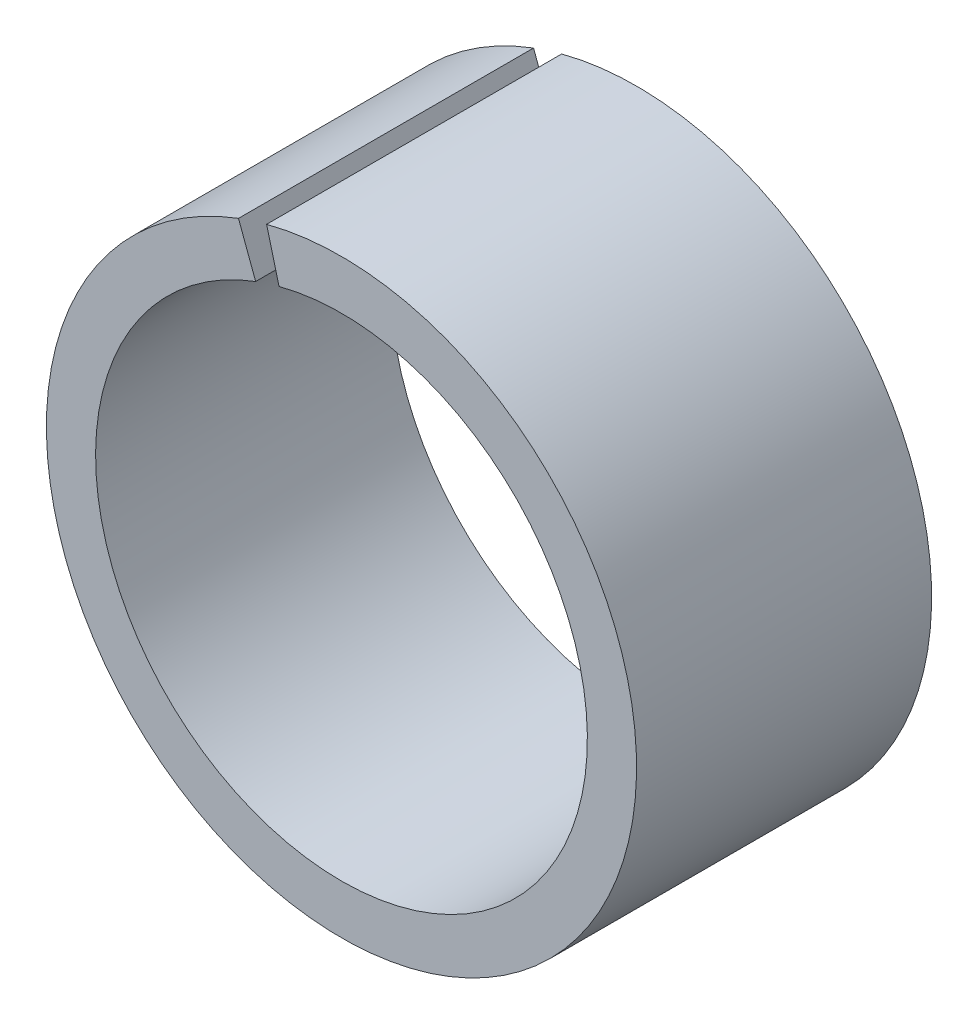
ISO-10303-21;
HEADER;
FILE_DESCRIPTION(('STEP AP214'),'2;1');
FILE_NAME('part.step','',(''),(''),'','','');
FILE_SCHEMA(('AUTOMOTIVE_DESIGN { 1 0 10303 214 1 1 1 1 }'));
ENDSEC;
DATA;
#1=APPLICATION_CONTEXT('core data for automotive mechanical design processes');
#2=APPLICATION_PROTOCOL_DEFINITION('international standard','automotive_design',2000,#1);
#3=PRODUCT_CONTEXT('',#1,'mechanical');
#4=PRODUCT('Part','Part','',(#3));
#5=PRODUCT_RELATED_PRODUCT_CATEGORY('part','',(#4));
#6=PRODUCT_DEFINITION_FORMATION('','',#4);
#7=PRODUCT_DEFINITION_CONTEXT('part definition',#1,'design');
#8=PRODUCT_DEFINITION('design','',#6,#7);
#9=PRODUCT_DEFINITION_SHAPE('','',#8);
#10=(LENGTH_UNIT() NAMED_UNIT(*) SI_UNIT(.MILLI.,.METRE.));
#11=(NAMED_UNIT(*) PLANE_ANGLE_UNIT() SI_UNIT($,.RADIAN.));
#12=(NAMED_UNIT(*) SI_UNIT($,.STERADIAN.) SOLID_ANGLE_UNIT());
#13=UNCERTAINTY_MEASURE_WITH_UNIT(LENGTH_MEASURE(1.E-05),#10,'distance_accuracy_value','');
#14=(GEOMETRIC_REPRESENTATION_CONTEXT(3) GLOBAL_UNCERTAINTY_ASSIGNED_CONTEXT((#13)) GLOBAL_UNIT_ASSIGNED_CONTEXT((#10,
#11,#12)) REPRESENTATION_CONTEXT('',''));
#15=CARTESIAN_POINT('',(0.,0.,0.));
#16=DIRECTION('',(0.,0.,1.));
#17=DIRECTION('',(1.,0.,0.));
#18=AXIS2_PLACEMENT_3D('',#15,#16,#17);
#19=CARTESIAN_POINT('',(0.,0.,6.));
#20=DIRECTION('',(0.,0.,1.));
#21=DIRECTION('',(1.,0.,0.));
#22=AXIS2_PLACEMENT_3D('',#19,#20,#21);
#23=PLANE('',#22);
#24=DIRECTION('',(-0.253787310354396,0.967260048333995,0.));
#25=VECTOR('',#24,1.);
#26=CARTESIAN_POINT('',(0.,0.,6.));
#27=LINE('',#26,#25);
#28=CARTESIAN_POINT('',(-1.26893655177198,4.83630024166997,6.));
#29=VERTEX_POINT('',#28);
#30=CARTESIAN_POINT('',(-1.52272386212638,5.80356029000397,6.));
#31=VERTEX_POINT('',#30);
#32=EDGE_CURVE('E78',#29,#31,#27,.T.);
#33=ORIENTED_EDGE('',*,*,#32,.F.);
#34=CARTESIAN_POINT('',(0.,0.,6.));
#35=DIRECTION('',(0.,0.,1.));
#36=DIRECTION('',(1.,0.,0.));
#37=AXIS2_PLACEMENT_3D('',#34,#35,#36);
#38=CIRCLE('',#37,5.);
#39=CARTESIAN_POINT('',(-1.74533179706722,4.68549004034222,6.));
#40=VERTEX_POINT('',#39);
#41=EDGE_CURVE('E87',#40,#29,#38,.T.);
#42=ORIENTED_EDGE('',*,*,#41,.F.);
#43=DIRECTION('',(0.349066359413445,-0.937098008068443,0.));
#44=VECTOR('',#43,1.);
#45=CARTESIAN_POINT('',(0.,0.,6.));
#46=LINE('',#45,#44);
#47=CARTESIAN_POINT('',(-2.09439815648067,5.62258804841066,6.));
#48=VERTEX_POINT('',#47);
#49=EDGE_CURVE('E61',#48,#40,#46,.T.);
#50=ORIENTED_EDGE('',*,*,#49,.F.);
#51=CARTESIAN_POINT('',(0.,0.,6.));
#52=DIRECTION('',(0.,0.,1.));
#53=DIRECTION('',(1.,0.,0.));
#54=AXIS2_PLACEMENT_3D('',#51,#52,#53);
#55=CIRCLE('',#54,6.);
#56=EDGE_CURVE('E89',#48,#31,#55,.T.);
#57=ORIENTED_EDGE('',*,*,#56,.T.);
#58=EDGE_LOOP('',(#33,#42,#50,#57));
#59=FACE_BOUND('',#58,.T.);
#60=ADVANCED_FACE('F38',(#59),#23,.T.);
#61=CARTESIAN_POINT('',(0.,0.,0.));
#62=DIRECTION('',(0.,0.,1.));
#63=DIRECTION('',(1.,0.,0.));
#64=AXIS2_PLACEMENT_3D('',#61,#62,#63);
#65=PLANE('',#64);
#66=CARTESIAN_POINT('',(0.,0.,0.));
#67=DIRECTION('',(0.,0.,1.));
#68=DIRECTION('',(1.,0.,0.));
#69=AXIS2_PLACEMENT_3D('',#66,#67,#68);
#70=CIRCLE('',#69,5.);
#71=CARTESIAN_POINT('',(-1.74533179706722,4.68549004034221,0.));
#72=VERTEX_POINT('',#71);
#73=CARTESIAN_POINT('',(-1.26893655177198,4.83630024166997,0.));
#74=VERTEX_POINT('',#73);
#75=EDGE_CURVE('E95',#72,#74,#70,.T.);
#76=ORIENTED_EDGE('',*,*,#75,.T.);
#77=DIRECTION('',(-0.253787310354396,0.967260048333995,0.));
#78=VECTOR('',#77,1.);
#79=CARTESIAN_POINT('',(0.,0.,0.));
#80=LINE('',#79,#78);
#81=CARTESIAN_POINT('',(-1.52272386212638,5.80356029000397,0.));
#82=VERTEX_POINT('',#81);
#83=EDGE_CURVE('E53',#74,#82,#80,.T.);
#84=ORIENTED_EDGE('',*,*,#83,.T.);
#85=CARTESIAN_POINT('',(0.,0.,0.));
#86=DIRECTION('',(0.,0.,1.));
#87=DIRECTION('',(1.,0.,0.));
#88=AXIS2_PLACEMENT_3D('',#85,#86,#87);
#89=CIRCLE('',#88,6.);
#90=CARTESIAN_POINT('',(-2.09439815648067,5.62258804841066,0.));
#91=VERTEX_POINT('',#90);
#92=EDGE_CURVE('E94',#91,#82,#89,.T.);
#93=ORIENTED_EDGE('',*,*,#92,.F.);
#94=DIRECTION('',(0.349066359413445,-0.937098008068443,0.));
#95=VECTOR('',#94,1.);
#96=CARTESIAN_POINT('',(0.,0.,0.));
#97=LINE('',#96,#95);
#98=EDGE_CURVE('E110',#91,#72,#97,.T.);
#99=ORIENTED_EDGE('',*,*,#98,.T.);
#100=EDGE_LOOP('',(#76,#84,#93,#99));
#101=FACE_BOUND('',#100,.T.);
#102=ADVANCED_FACE('F114',(#101),#65,.F.);
#103=CARTESIAN_POINT('',(0.,0.,6.));
#104=DIRECTION('',(0.,0.,-1.));
#105=DIRECTION('',(-1.,0.,0.));
#106=AXIS2_PLACEMENT_3D('',#103,#104,#105);
#107=CYLINDRICAL_SURFACE('',#106,6.);
#108=ORIENTED_EDGE('',*,*,#92,.T.);
#109=DIRECTION('',(0.,0.,-1.));
#110=VECTOR('',#109,1.);
#111=CARTESIAN_POINT('',(-1.52272386212638,5.80356029000397,6.));
#112=LINE('',#111,#110);
#113=EDGE_CURVE('E101',#82,#31,#112,.F.);
#114=ORIENTED_EDGE('',*,*,#113,.T.);
#115=ORIENTED_EDGE('',*,*,#56,.F.);
#116=DIRECTION('',(0.,0.,-1.));
#117=VECTOR('',#116,1.);
#118=CARTESIAN_POINT('',(-2.09439815648067,5.62258804841066,6.));
#119=LINE('',#118,#117);
#120=EDGE_CURVE('E116',#48,#91,#119,.T.);
#121=ORIENTED_EDGE('',*,*,#120,.T.);
#122=EDGE_LOOP('',(#108,#114,#115,#121));
#123=FACE_BOUND('',#122,.T.);
#124=ADVANCED_FACE('F40',(#123),#107,.T.);
#125=CARTESIAN_POINT('',(0.,0.,6.));
#126=DIRECTION('',(0.,0.,-1.));
#127=DIRECTION('',(-1.,0.,0.));
#128=AXIS2_PLACEMENT_3D('',#125,#126,#127);
#129=CYLINDRICAL_SURFACE('',#128,5.);
#130=DIRECTION('',(0.,0.,-1.));
#131=VECTOR('',#130,1.);
#132=CARTESIAN_POINT('',(-1.26893655177198,4.83630024166997,6.));
#133=LINE('',#132,#131);
#134=EDGE_CURVE('E11',#74,#29,#133,.F.);
#135=ORIENTED_EDGE('',*,*,#134,.F.);
#136=ORIENTED_EDGE('',*,*,#75,.F.);
#137=DIRECTION('',(0.,0.,-1.));
#138=VECTOR('',#137,1.);
#139=CARTESIAN_POINT('',(-1.74533179706722,4.68549004034221,6.));
#140=LINE('',#139,#138);
#141=EDGE_CURVE('E47',#40,#72,#140,.T.);
#142=ORIENTED_EDGE('',*,*,#141,.F.);
#143=ORIENTED_EDGE('',*,*,#41,.T.);
#144=EDGE_LOOP('',(#135,#136,#142,#143));
#145=FACE_BOUND('',#144,.T.);
#146=ADVANCED_FACE('F92',(#145),#129,.F.);
#147=CARTESIAN_POINT('',(0.,0.,-4.));
#148=DIRECTION('',(-0.937098008068443,-0.349066359413445,0.));
#149=DIRECTION('',(0.349066359413445,-0.937098008068443,0.));
#150=AXIS2_PLACEMENT_3D('',#147,#148,#149);
#151=PLANE('',#150);
#152=ORIENTED_EDGE('',*,*,#49,.T.);
#153=ORIENTED_EDGE('',*,*,#141,.T.);
#154=ORIENTED_EDGE('',*,*,#98,.F.);
#155=ORIENTED_EDGE('',*,*,#120,.F.);
#156=EDGE_LOOP('',(#152,#153,#154,#155));
#157=FACE_BOUND('',#156,.T.);
#158=ADVANCED_FACE('F109',(#157),#151,.F.);
#159=CARTESIAN_POINT('',(0.,0.,-4.));
#160=DIRECTION('',(0.967260048333995,0.253787310354396,0.));
#161=DIRECTION('',(-0.253787310354396,0.967260048333995,0.));
#162=AXIS2_PLACEMENT_3D('',#159,#160,#161);
#163=PLANE('',#162);
#164=ORIENTED_EDGE('',*,*,#83,.F.);
#165=ORIENTED_EDGE('',*,*,#134,.T.);
#166=ORIENTED_EDGE('',*,*,#32,.T.);
#167=ORIENTED_EDGE('',*,*,#113,.F.);
#168=EDGE_LOOP('',(#164,#165,#166,#167));
#169=FACE_BOUND('',#168,.T.);
#170=ADVANCED_FACE('F77',(#169),#163,.F.);
#171=CLOSED_SHELL('',(#60,#102,#124,#146,#158,#170));
#172=MANIFOLD_SOLID_BREP('B2',#171);
#173=ADVANCED_BREP_SHAPE_REPRESENTATION('',(#18,#172),#14);
#174=SHAPE_DEFINITION_REPRESENTATION(#9,#173);
ENDSEC;
END-ISO-10303-21;
